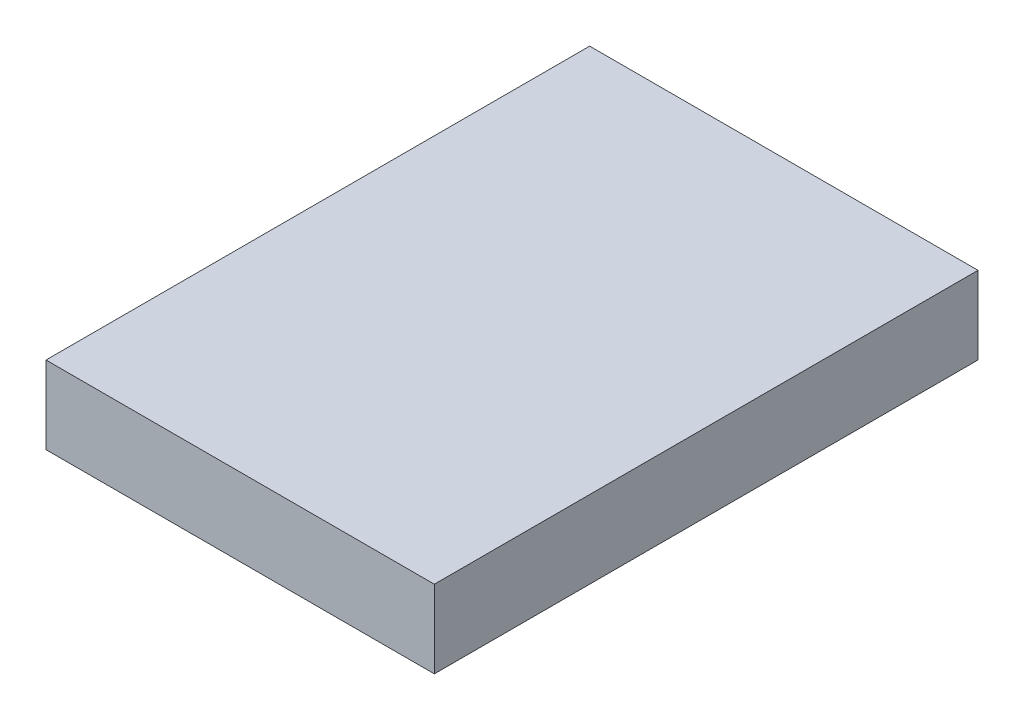
ISO-10303-21;
HEADER;
FILE_DESCRIPTION(('STEP AP214'),'2;1');
FILE_NAME('part.step','',(''),(''),'','','');
FILE_SCHEMA(('AUTOMOTIVE_DESIGN { 1 0 10303 214 1 1 1 1 }'));
ENDSEC;
DATA;
#1=APPLICATION_CONTEXT('core data for automotive mechanical design processes');
#2=APPLICATION_PROTOCOL_DEFINITION('international standard','automotive_design',2000,#1);
#3=PRODUCT_CONTEXT('',#1,'mechanical');
#4=PRODUCT('Part','Part','',(#3));
#5=PRODUCT_RELATED_PRODUCT_CATEGORY('part','',(#4));
#6=PRODUCT_DEFINITION_FORMATION('','',#4);
#7=PRODUCT_DEFINITION_CONTEXT('part definition',#1,'design');
#8=PRODUCT_DEFINITION('design','',#6,#7);
#9=PRODUCT_DEFINITION_SHAPE('','',#8);
#10=(LENGTH_UNIT() NAMED_UNIT(*) SI_UNIT(.MILLI.,.METRE.));
#11=(NAMED_UNIT(*) PLANE_ANGLE_UNIT() SI_UNIT($,.RADIAN.));
#12=(NAMED_UNIT(*) SI_UNIT($,.STERADIAN.) SOLID_ANGLE_UNIT());
#13=UNCERTAINTY_MEASURE_WITH_UNIT(LENGTH_MEASURE(1.E-05),#10,'distance_accuracy_value','');
#14=(GEOMETRIC_REPRESENTATION_CONTEXT(3) GLOBAL_UNCERTAINTY_ASSIGNED_CONTEXT((#13)) GLOBAL_UNIT_ASSIGNED_CONTEXT((#10,
#11,#12)) REPRESENTATION_CONTEXT('',''));
#15=CARTESIAN_POINT('',(0.,0.,0.));
#16=DIRECTION('',(0.,0.,1.));
#17=DIRECTION('',(1.,0.,0.));
#18=AXIS2_PLACEMENT_3D('',#15,#16,#17);
#19=CARTESIAN_POINT('',(25.,10.,-35.));
#20=DIRECTION('',(-1.,0.,0.));
#21=DIRECTION('',(0.,0.,1.));
#22=AXIS2_PLACEMENT_3D('',#19,#20,#21);
#23=PLANE('',#22);
#24=DIRECTION('',(0.,0.,-1.));
#25=VECTOR('',#24,1.);
#26=CARTESIAN_POINT('',(25.,0.,-35.));
#27=LINE('',#26,#25);
#28=CARTESIAN_POINT('',(25.,0.,35.));
#29=VERTEX_POINT('',#28);
#30=CARTESIAN_POINT('',(25.,0.,-35.));
#31=VERTEX_POINT('',#30);
#32=EDGE_CURVE('E98',#29,#31,#27,.T.);
#33=ORIENTED_EDGE('',*,*,#32,.T.);
#34=DIRECTION('',(0.,-1.,0.));
#35=VECTOR('',#34,1.);
#36=CARTESIAN_POINT('',(25.,10.,-35.));
#37=LINE('',#36,#35);
#38=CARTESIAN_POINT('',(25.,10.,-35.));
#39=VERTEX_POINT('',#38);
#40=EDGE_CURVE('E11',#39,#31,#37,.T.);
#41=ORIENTED_EDGE('',*,*,#40,.F.);
#42=DIRECTION('',(0.,0.,-1.));
#43=VECTOR('',#42,1.);
#44=CARTESIAN_POINT('',(25.,10.,-35.));
#45=LINE('',#44,#43);
#46=CARTESIAN_POINT('',(25.,10.,35.));
#47=VERTEX_POINT('',#46);
#48=EDGE_CURVE('E86',#47,#39,#45,.T.);
#49=ORIENTED_EDGE('',*,*,#48,.F.);
#50=DIRECTION('',(0.,-1.,0.));
#51=VECTOR('',#50,1.);
#52=CARTESIAN_POINT('',(25.,10.,35.));
#53=LINE('',#52,#51);
#54=EDGE_CURVE('E94',#47,#29,#53,.T.);
#55=ORIENTED_EDGE('',*,*,#54,.T.);
#56=EDGE_LOOP('',(#33,#41,#49,#55));
#57=FACE_BOUND('',#56,.T.);
#58=ADVANCED_FACE('F35',(#57),#23,.F.);
#59=CARTESIAN_POINT('',(-25.,10.,-35.));
#60=DIRECTION('',(0.,0.,1.));
#61=DIRECTION('',(1.,0.,0.));
#62=AXIS2_PLACEMENT_3D('',#59,#60,#61);
#63=PLANE('',#62);
#64=DIRECTION('',(-1.,0.,0.));
#65=VECTOR('',#64,1.);
#66=CARTESIAN_POINT('',(-25.,0.,-35.));
#67=LINE('',#66,#65);
#68=CARTESIAN_POINT('',(-25.,0.,-35.));
#69=VERTEX_POINT('',#68);
#70=EDGE_CURVE('E90',#31,#69,#67,.T.);
#71=ORIENTED_EDGE('',*,*,#70,.T.);
#72=DIRECTION('',(0.,-1.,0.));
#73=VECTOR('',#72,1.);
#74=CARTESIAN_POINT('',(-25.,10.,-35.));
#75=LINE('',#74,#73);
#76=CARTESIAN_POINT('',(-25.,10.,-35.));
#77=VERTEX_POINT('',#76);
#78=EDGE_CURVE('E43',#77,#69,#75,.T.);
#79=ORIENTED_EDGE('',*,*,#78,.F.);
#80=DIRECTION('',(-1.,0.,0.));
#81=VECTOR('',#80,1.);
#82=CARTESIAN_POINT('',(-25.,10.,-35.));
#83=LINE('',#82,#81);
#84=EDGE_CURVE('E81',#39,#77,#83,.T.);
#85=ORIENTED_EDGE('',*,*,#84,.F.);
#86=ORIENTED_EDGE('',*,*,#40,.T.);
#87=EDGE_LOOP('',(#71,#79,#85,#86));
#88=FACE_BOUND('',#87,.T.);
#89=ADVANCED_FACE('F89',(#88),#63,.F.);
#90=CARTESIAN_POINT('',(-25.,10.,-35.));
#91=DIRECTION('',(1.,0.,0.));
#92=DIRECTION('',(0.,0.,-1.));
#93=AXIS2_PLACEMENT_3D('',#90,#91,#92);
#94=PLANE('',#93);
#95=DIRECTION('',(0.,0.,1.));
#96=VECTOR('',#95,1.);
#97=CARTESIAN_POINT('',(-25.,0.,-35.));
#98=LINE('',#97,#96);
#99=CARTESIAN_POINT('',(-25.,0.,35.));
#100=VERTEX_POINT('',#99);
#101=EDGE_CURVE('E68',#69,#100,#98,.T.);
#102=ORIENTED_EDGE('',*,*,#101,.T.);
#103=DIRECTION('',(0.,-1.,0.));
#104=VECTOR('',#103,1.);
#105=CARTESIAN_POINT('',(-25.,10.,35.));
#106=LINE('',#105,#104);
#107=CARTESIAN_POINT('',(-25.,10.,35.));
#108=VERTEX_POINT('',#107);
#109=EDGE_CURVE('E91',#108,#100,#106,.T.);
#110=ORIENTED_EDGE('',*,*,#109,.F.);
#111=DIRECTION('',(0.,0.,1.));
#112=VECTOR('',#111,1.);
#113=CARTESIAN_POINT('',(-25.,10.,-35.));
#114=LINE('',#113,#112);
#115=EDGE_CURVE('E84',#77,#108,#114,.T.);
#116=ORIENTED_EDGE('',*,*,#115,.F.);
#117=ORIENTED_EDGE('',*,*,#78,.T.);
#118=EDGE_LOOP('',(#102,#110,#116,#117));
#119=FACE_BOUND('',#118,.T.);
#120=ADVANCED_FACE('F92',(#119),#94,.F.);
#121=CARTESIAN_POINT('',(-25.,10.,35.));
#122=DIRECTION('',(0.,0.,-1.));
#123=DIRECTION('',(-1.,0.,0.));
#124=AXIS2_PLACEMENT_3D('',#121,#122,#123);
#125=PLANE('',#124);
#126=DIRECTION('',(1.,0.,0.));
#127=VECTOR('',#126,1.);
#128=CARTESIAN_POINT('',(-25.,0.,35.));
#129=LINE('',#128,#127);
#130=EDGE_CURVE('E74',#100,#29,#129,.T.);
#131=ORIENTED_EDGE('',*,*,#130,.T.);
#132=ORIENTED_EDGE('',*,*,#54,.F.);
#133=DIRECTION('',(1.,0.,0.));
#134=VECTOR('',#133,1.);
#135=CARTESIAN_POINT('',(-25.,10.,35.));
#136=LINE('',#135,#134);
#137=EDGE_CURVE('E51',#108,#47,#136,.T.);
#138=ORIENTED_EDGE('',*,*,#137,.F.);
#139=ORIENTED_EDGE('',*,*,#109,.T.);
#140=EDGE_LOOP('',(#131,#132,#138,#139));
#141=FACE_BOUND('',#140,.T.);
#142=ADVANCED_FACE('F105',(#141),#125,.F.);
#143=CARTESIAN_POINT('',(0.,10.,0.));
#144=DIRECTION('',(0.,1.,0.));
#145=DIRECTION('',(0.,0.,1.));
#146=AXIS2_PLACEMENT_3D('',#143,#144,#145);
#147=PLANE('',#146);
#148=ORIENTED_EDGE('',*,*,#48,.T.);
#149=ORIENTED_EDGE('',*,*,#84,.T.);
#150=ORIENTED_EDGE('',*,*,#115,.T.);
#151=ORIENTED_EDGE('',*,*,#137,.T.);
#152=EDGE_LOOP('',(#148,#149,#150,#151));
#153=FACE_BOUND('',#152,.T.);
#154=ADVANCED_FACE('F82',(#153),#147,.T.);
#155=CARTESIAN_POINT('',(0.,0.,0.));
#156=DIRECTION('',(0.,1.,0.));
#157=DIRECTION('',(0.,0.,1.));
#158=AXIS2_PLACEMENT_3D('',#155,#156,#157);
#159=PLANE('',#158);
#160=ORIENTED_EDGE('',*,*,#32,.F.);
#161=ORIENTED_EDGE('',*,*,#130,.F.);
#162=ORIENTED_EDGE('',*,*,#101,.F.);
#163=ORIENTED_EDGE('',*,*,#70,.F.);
#164=EDGE_LOOP('',(#160,#161,#162,#163));
#165=FACE_BOUND('',#164,.T.);
#166=ADVANCED_FACE('F108',(#165),#159,.F.);
#167=CLOSED_SHELL('',(#58,#89,#120,#142,#154,#166));
#168=MANIFOLD_SOLID_BREP('B2',#167);
#169=ADVANCED_BREP_SHAPE_REPRESENTATION('',(#18,#168),#14);
#170=SHAPE_DEFINITION_REPRESENTATION(#9,#169);
ENDSEC;
END-ISO-10303-21;
